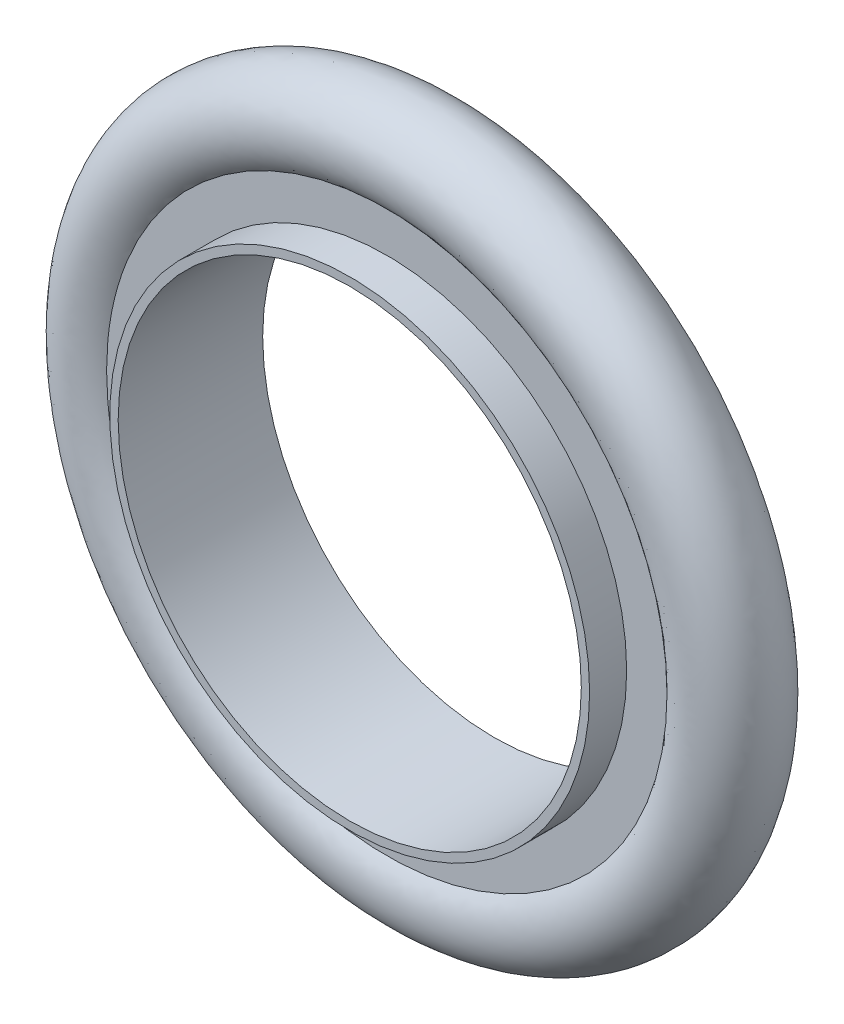
ISO-10303-21;
HEADER;
FILE_DESCRIPTION(('STEP AP214'),'2;1');
FILE_NAME('part.step','',(''),(''),'','','');
FILE_SCHEMA(('AUTOMOTIVE_DESIGN { 1 0 10303 214 1 1 1 1 }'));
ENDSEC;
DATA;
#1=APPLICATION_CONTEXT('core data for automotive mechanical design processes');
#2=APPLICATION_PROTOCOL_DEFINITION('international standard','automotive_design',2000,#1);
#3=PRODUCT_CONTEXT('',#1,'mechanical');
#4=PRODUCT('Part','Part','',(#3));
#5=PRODUCT_RELATED_PRODUCT_CATEGORY('part','',(#4));
#6=PRODUCT_DEFINITION_FORMATION('','',#4);
#7=PRODUCT_DEFINITION_CONTEXT('part definition',#1,'design');
#8=PRODUCT_DEFINITION('design','',#6,#7);
#9=PRODUCT_DEFINITION_SHAPE('','',#8);
#10=(LENGTH_UNIT() NAMED_UNIT(*) SI_UNIT(.MILLI.,.METRE.));
#11=(NAMED_UNIT(*) PLANE_ANGLE_UNIT() SI_UNIT($,.RADIAN.));
#12=(NAMED_UNIT(*) SI_UNIT($,.STERADIAN.) SOLID_ANGLE_UNIT());
#13=UNCERTAINTY_MEASURE_WITH_UNIT(LENGTH_MEASURE(1.E-05),#10,'distance_accuracy_value','');
#14=(GEOMETRIC_REPRESENTATION_CONTEXT(3) GLOBAL_UNCERTAINTY_ASSIGNED_CONTEXT((#13)) GLOBAL_UNIT_ASSIGNED_CONTEXT((#10,
#11,#12)) REPRESENTATION_CONTEXT('',''));
#15=CARTESIAN_POINT('',(0.,0.,0.));
#16=DIRECTION('',(0.,0.,1.));
#17=DIRECTION('',(1.,0.,0.));
#18=AXIS2_PLACEMENT_3D('',#15,#16,#17);
#19=CARTESIAN_POINT('',(0.,0.,-3.9));
#20=DIRECTION('',(0.,0.,1.));
#21=DIRECTION('',(1.,0.,0.));
#22=AXIS2_PLACEMENT_3D('',#19,#20,#21);
#23=CYLINDRICAL_SURFACE('',#22,12.95);
#24=CARTESIAN_POINT('',(0.,0.,-1.9));
#25=DIRECTION('',(0.,0.,1.));
#26=DIRECTION('',(1.,0.,0.));
#27=AXIS2_PLACEMENT_3D('',#24,#25,#26);
#28=CIRCLE('',#27,12.95);
#29=CARTESIAN_POINT('',(12.95,0.,-1.9));
#30=VERTEX_POINT('',#29);
#31=EDGE_CURVE('P0_E42',#30,#30,#28,.T.);
#32=ORIENTED_EDGE('',*,*,#31,.F.);
#33=EDGE_LOOP('',(#32));
#34=FACE_BOUND('',#33,.T.);
#35=CARTESIAN_POINT('',(0.,0.,-3.9));
#36=DIRECTION('',(0.,0.,-1.));
#37=DIRECTION('',(1.,0.,0.));
#38=AXIS2_PLACEMENT_3D('',#35,#36,#37);
#39=CIRCLE('',#38,12.95);
#40=CARTESIAN_POINT('',(12.95,0.,-3.9));
#41=VERTEX_POINT('',#40);
#42=EDGE_CURVE('P0_E10',#41,#41,#39,.T.);
#43=ORIENTED_EDGE('',*,*,#42,.F.);
#44=EDGE_LOOP('',(#43));
#45=FACE_BOUND('',#44,.T.);
#46=ADVANCED_FACE('P0_F16',(#34,#45),#23,.T.);
#47=CARTESIAN_POINT('',(-12.95,13.21159,-3.9));
#48=DIRECTION('',(0.,0.,-1.));
#49=DIRECTION('',(0.,-1.,0.));
#50=AXIS2_PLACEMENT_3D('',#47,#48,#49);
#51=PLANE('',#50);
#52=ORIENTED_EDGE('',*,*,#42,.T.);
#53=EDGE_LOOP('',(#52));
#54=FACE_BOUND('',#53,.T.);
#55=CARTESIAN_POINT('',(0.,0.,-3.9));
#56=DIRECTION('',(0.,0.,1.));
#57=DIRECTION('',(1.,0.,0.));
#58=AXIS2_PLACEMENT_3D('',#55,#56,#57);
#59=CIRCLE('',#58,12.5);
#60=CARTESIAN_POINT('',(12.5,0.,-3.9));
#61=VERTEX_POINT('',#60);
#62=EDGE_CURVE('P0_E29',#61,#61,#59,.T.);
#63=ORIENTED_EDGE('',*,*,#62,.T.);
#64=EDGE_LOOP('',(#63));
#65=FACE_BOUND('',#64,.T.);
#66=ADVANCED_FACE('P0_F120',(#54,#65),#51,.T.);
#67=CARTESIAN_POINT('',(-15.1251923190728,15.4307212039181,-1.9));
#68=DIRECTION('',(0.,0.,-1.));
#69=DIRECTION('',(0.,-1.,0.));
#70=AXIS2_PLACEMENT_3D('',#67,#68,#69);
#71=PLANE('',#70);
#72=CARTESIAN_POINT('',(0.,0.,-1.9));
#73=DIRECTION('',(0.,0.,-1.));
#74=DIRECTION('',(1.,0.,0.));
#75=AXIS2_PLACEMENT_3D('',#72,#73,#74);
#76=CIRCLE('',#75,15.1251923190728);
#77=CARTESIAN_POINT('',(15.1251923190728,0.,-1.9));
#78=VERTEX_POINT('',#77);
#79=EDGE_CURVE('P0_E69',#78,#78,#76,.T.);
#80=ORIENTED_EDGE('',*,*,#79,.T.);
#81=EDGE_LOOP('',(#80));
#82=FACE_BOUND('',#81,.T.);
#83=ORIENTED_EDGE('',*,*,#31,.T.);
#84=EDGE_LOOP('',(#83));
#85=FACE_BOUND('',#84,.T.);
#86=ADVANCED_FACE('P0_F126',(#82,#85),#71,.T.);
#87=CARTESIAN_POINT('',(0.,0.,3.9));
#88=DIRECTION('',(0.,0.,1.));
#89=DIRECTION('',(1.,0.,0.));
#90=AXIS2_PLACEMENT_3D('',#87,#88,#89);
#91=CYLINDRICAL_SURFACE('',#90,12.5);
#92=CARTESIAN_POINT('',(0.,0.,3.9));
#93=DIRECTION('',(0.,0.,-1.));
#94=DIRECTION('',(1.,0.,0.));
#95=AXIS2_PLACEMENT_3D('',#92,#93,#94);
#96=CIRCLE('',#95,12.5);
#97=CARTESIAN_POINT('',(12.5,0.,3.9));
#98=VERTEX_POINT('',#97);
#99=EDGE_CURVE('P0_E92',#98,#98,#96,.T.);
#100=ORIENTED_EDGE('',*,*,#99,.F.);
#101=EDGE_LOOP('',(#100));
#102=FACE_BOUND('',#101,.T.);
#103=ORIENTED_EDGE('',*,*,#62,.F.);
#104=EDGE_LOOP('',(#103));
#105=FACE_BOUND('',#104,.T.);
#106=ADVANCED_FACE('P0_F76',(#102,#105),#91,.F.);
#107=CARTESIAN_POINT('',(15.1251923190728,0.,-1.9));
#108=CARTESIAN_POINT('',(15.1251923190728,30.2503846381455,-1.9));
#109=CARTESIAN_POINT('',(-15.1251923190728,30.2503846381455,-1.9));
#110=CARTESIAN_POINT('',(-15.1251923190728,0.,-1.9));
#111=CARTESIAN_POINT('',(-15.1251923190728,-30.2503846381455,-1.9));
#112=CARTESIAN_POINT('',(15.1251923190728,-30.2503846381455,-1.9));
#113=CARTESIAN_POINT('',(15.1251923190728,0.,-1.9));
#114=CARTESIAN_POINT('',(13.8694561444583,0.,-0.826142220141142));
#115=CARTESIAN_POINT('',(13.8694561444583,27.7389122889165,-0.826142220141142));
#116=CARTESIAN_POINT('',(-13.8694561444583,27.7389122889165,-0.826142220141142));
#117=CARTESIAN_POINT('',(-13.8694561444583,0.,-0.826142220141142));
#118=CARTESIAN_POINT('',(-13.8694561444583,-27.7389122889165,-0.826142220141142));
#119=CARTESIAN_POINT('',(13.8694561444583,-27.7389122889165,-0.826142220141142));
#120=CARTESIAN_POINT('',(13.8694561444583,0.,-0.826142220141142));
#121=CARTESIAN_POINT('',(13.8694561444583,0.,0.826142220141143));
#122=CARTESIAN_POINT('',(13.8694561444583,27.7389122889165,0.826142220141142));
#123=CARTESIAN_POINT('',(-13.8694561444583,27.7389122889165,0.826142220141142));
#124=CARTESIAN_POINT('',(-13.8694561444583,0.,0.826142220141143));
#125=CARTESIAN_POINT('',(-13.8694561444583,-27.7389122889165,0.826142220141142));
#126=CARTESIAN_POINT('',(13.8694561444583,-27.7389122889165,0.826142220141142));
#127=CARTESIAN_POINT('',(13.8694561444583,0.,0.826142220141143));
#128=CARTESIAN_POINT('',(15.1251923190728,0.,1.9));
#129=CARTESIAN_POINT('',(15.1251923190728,30.2503846381455,1.9));
#130=CARTESIAN_POINT('',(-15.1251923190728,30.2503846381455,1.9));
#131=CARTESIAN_POINT('',(-15.1251923190728,0.,1.9));
#132=CARTESIAN_POINT('',(-15.1251923190728,-30.2503846381455,1.9));
#133=CARTESIAN_POINT('',(15.1251923190728,-30.2503846381455,1.9));
#134=CARTESIAN_POINT('',(15.1251923190728,0.,1.9));
#135=(BOUNDED_SURFACE() B_SPLINE_SURFACE(3,3,((#107,#108,#109,#110,#111,#112,#113),(#114,#115,
#116,#117,#118,#119,#120),(#121,#122,#123,#124,#125,#126,#127),(#128,#129,#130,#131,#132,#133,
#134)),.UNSPECIFIED.,.F.,.T.,.F.) B_SPLINE_SURFACE_WITH_KNOTS((4,4),(4,3,4),(0.,1.),(0.,0.5,1.),
.UNSPECIFIED.) GEOMETRIC_REPRESENTATION_ITEM() RATIONAL_B_SPLINE_SURFACE(((1.,0.333333333333334,
0.333333333333334,1.,0.333333333333334,0.333333333333334,1.),(0.766615381580585,
0.255538460526862,0.255538460526862,0.766615381580585,0.255538460526862,0.255538460526862,
0.766615381580585),(0.766615381580585,0.255538460526862,0.255538460526862,0.766615381580585,
0.255538460526862,0.255538460526862,0.766615381580585),(1.,0.333333333333334,0.333333333333334,
1.,0.333333333333334,0.333333333333334,1.))) REPRESENTATION_ITEM('') SURFACE());
#136=CARTESIAN_POINT('',(0.,0.,1.9));
#137=DIRECTION('',(0.,0.,1.));
#138=DIRECTION('',(1.,0.,0.));
#139=AXIS2_PLACEMENT_3D('',#136,#137,#138);
#140=CIRCLE('',#139,15.1251923190728);
#141=CARTESIAN_POINT('',(15.1251923190728,0.,1.9));
#142=VERTEX_POINT('',#141);
#143=EDGE_CURVE('P0_E22',#142,#142,#140,.T.);
#144=ORIENTED_EDGE('',*,*,#143,.F.);
#145=EDGE_LOOP('',(#144));
#146=FACE_BOUND('',#145,.T.);
#147=ORIENTED_EDGE('',*,*,#79,.F.);
#148=EDGE_LOOP('',(#147));
#149=FACE_BOUND('',#148,.T.);
#150=ADVANCED_FACE('P0_F18',(#146,#149),#135,.F.);
#151=CARTESIAN_POINT('',(-12.95,-13.21159,3.9));
#152=DIRECTION('',(0.,0.,1.));
#153=DIRECTION('',(1.,0.,0.));
#154=AXIS2_PLACEMENT_3D('',#151,#152,#153);
#155=PLANE('',#154);
#156=CARTESIAN_POINT('',(0.,0.,3.9));
#157=DIRECTION('',(0.,0.,1.));
#158=DIRECTION('',(1.,0.,0.));
#159=AXIS2_PLACEMENT_3D('',#156,#157,#158);
#160=CIRCLE('',#159,12.95);
#161=CARTESIAN_POINT('',(12.95,0.,3.9));
#162=VERTEX_POINT('',#161);
#163=EDGE_CURVE('P0_E91',#162,#162,#160,.T.);
#164=ORIENTED_EDGE('',*,*,#163,.T.);
#165=EDGE_LOOP('',(#164));
#166=FACE_BOUND('',#165,.T.);
#167=ORIENTED_EDGE('',*,*,#99,.T.);
#168=EDGE_LOOP('',(#167));
#169=FACE_BOUND('',#168,.T.);
#170=ADVANCED_FACE('P0_F101',(#166,#169),#155,.T.);
#171=CARTESIAN_POINT('',(-15.1251923190728,-15.4307212039181,1.9));
#172=DIRECTION('',(0.,0.,1.));
#173=DIRECTION('',(1.,0.,0.));
#174=AXIS2_PLACEMENT_3D('',#171,#172,#173);
#175=PLANE('',#174);
#176=ORIENTED_EDGE('',*,*,#143,.T.);
#177=EDGE_LOOP('',(#176));
#178=FACE_BOUND('',#177,.T.);
#179=CARTESIAN_POINT('',(0.,0.,1.9));
#180=DIRECTION('',(0.,0.,-1.));
#181=DIRECTION('',(1.,0.,0.));
#182=AXIS2_PLACEMENT_3D('',#179,#180,#181);
#183=CIRCLE('',#182,12.95);
#184=CARTESIAN_POINT('',(12.95,0.,1.9));
#185=VERTEX_POINT('',#184);
#186=EDGE_CURVE('P0_E85',#185,#185,#183,.T.);
#187=ORIENTED_EDGE('',*,*,#186,.T.);
#188=EDGE_LOOP('',(#187));
#189=FACE_BOUND('',#188,.T.);
#190=ADVANCED_FACE('P0_F107',(#178,#189),#175,.T.);
#191=CARTESIAN_POINT('',(0.,0.,1.9));
#192=DIRECTION('',(0.,0.,1.));
#193=DIRECTION('',(1.,0.,0.));
#194=AXIS2_PLACEMENT_3D('',#191,#192,#193);
#195=CYLINDRICAL_SURFACE('',#194,12.95);
#196=ORIENTED_EDGE('',*,*,#163,.F.);
#197=EDGE_LOOP('',(#196));
#198=FACE_BOUND('',#197,.T.);
#199=ORIENTED_EDGE('',*,*,#186,.F.);
#200=EDGE_LOOP('',(#199));
#201=FACE_BOUND('',#200,.T.);
#202=ADVANCED_FACE('P0_F104',(#198,#201),#195,.T.);
#203=CLOSED_SHELL('',(#46,#66,#86,#106,#150,#170,#190,#202));
#204=MANIFOLD_SOLID_BREP('P0_B1',#203);
#205=CARTESIAN_POINT('',(14.25,0.,0.));
#206=CARTESIAN_POINT('',(14.25,28.5,0.));
#207=CARTESIAN_POINT('',(-14.25,28.5,0.));
#208=CARTESIAN_POINT('',(-14.25,0.,0.));
#209=CARTESIAN_POINT('',(-14.25,-28.5,0.));
#210=CARTESIAN_POINT('',(14.25,-28.5,0.));
#211=CARTESIAN_POINT('',(14.25,0.,0.));
#212=CARTESIAN_POINT('',(14.25,0.,-4.99999999999999));
#213=CARTESIAN_POINT('',(14.25,28.5000000000001,-5.00000000000001));
#214=CARTESIAN_POINT('',(-14.25,28.5000000000001,-5.00000000000001));
#215=CARTESIAN_POINT('',(-14.25,0.,-4.99999999999999));
#216=CARTESIAN_POINT('',(-14.25,-28.5000000000001,-5.00000000000001));
#217=CARTESIAN_POINT('',(14.25,-28.5000000000001,-5.00000000000001));
#218=CARTESIAN_POINT('',(14.25,0.,-4.99999999999999));
#219=CARTESIAN_POINT('',(19.25,0.,-4.99999999999999));
#220=CARTESIAN_POINT('',(19.25,38.5,-5.00000000000001));
#221=CARTESIAN_POINT('',(-19.25,38.5,-5.00000000000001));
#222=CARTESIAN_POINT('',(-19.25,0.,-4.99999999999999));
#223=CARTESIAN_POINT('',(-19.25,-38.5,-5.00000000000001));
#224=CARTESIAN_POINT('',(19.25,-38.5,-5.00000000000001));
#225=CARTESIAN_POINT('',(19.25,0.,-4.99999999999999));
#226=CARTESIAN_POINT('',(19.25,0.,0.));
#227=CARTESIAN_POINT('',(19.25,38.4999999999999,0.));
#228=CARTESIAN_POINT('',(-19.25,38.4999999999999,0.));
#229=CARTESIAN_POINT('',(-19.25,0.,0.));
#230=CARTESIAN_POINT('',(-19.25,-38.4999999999999,0.));
#231=CARTESIAN_POINT('',(19.25,-38.4999999999999,0.));
#232=CARTESIAN_POINT('',(19.25,0.,0.));
#233=CARTESIAN_POINT('',(19.25,0.,4.99999999999999));
#234=CARTESIAN_POINT('',(19.25,38.5,5.00000000000001));
#235=CARTESIAN_POINT('',(-19.25,38.5,5.00000000000001));
#236=CARTESIAN_POINT('',(-19.25,0.,4.99999999999999));
#237=CARTESIAN_POINT('',(-19.25,-38.5,5.00000000000001));
#238=CARTESIAN_POINT('',(19.25,-38.5,5.00000000000001));
#239=CARTESIAN_POINT('',(19.25,0.,4.99999999999999));
#240=CARTESIAN_POINT('',(14.25,0.,4.99999999999999));
#241=CARTESIAN_POINT('',(14.25,28.5000000000001,5.00000000000001));
#242=CARTESIAN_POINT('',(-14.25,28.5000000000001,5.00000000000001));
#243=CARTESIAN_POINT('',(-14.25,0.,4.99999999999999));
#244=CARTESIAN_POINT('',(-14.25,-28.5000000000001,5.00000000000001));
#245=CARTESIAN_POINT('',(14.25,-28.5000000000001,5.00000000000001));
#246=CARTESIAN_POINT('',(14.25,0.,4.99999999999999));
#247=CARTESIAN_POINT('',(14.25,0.,0.));
#248=CARTESIAN_POINT('',(14.25,28.5,0.));
#249=CARTESIAN_POINT('',(-14.25,28.5,0.));
#250=CARTESIAN_POINT('',(-14.25,0.,0.));
#251=CARTESIAN_POINT('',(-14.25,-28.5,0.));
#252=CARTESIAN_POINT('',(14.25,-28.5,0.));
#253=CARTESIAN_POINT('',(14.25,0.,0.));
#254=(BOUNDED_SURFACE() B_SPLINE_SURFACE(3,3,((#205,#206,#207,#208,#209,#210,#211),(#212,#213,
#214,#215,#216,#217,#218),(#219,#220,#221,#222,#223,#224,#225),(#226,#227,#228,#229,#230,#231,
#232),(#233,#234,#235,#236,#237,#238,#239),(#240,#241,#242,#243,#244,#245,#246),(#247,#248,#249,
#250,#251,#252,#253)),.UNSPECIFIED.,.T.,.T.,.F.) B_SPLINE_SURFACE_WITH_KNOTS((4,3,4),(4,3,4),
(0.,0.5,1.),(0.,0.5,1.),
.UNSPECIFIED.) GEOMETRIC_REPRESENTATION_ITEM() RATIONAL_B_SPLINE_SURFACE(((1.,0.333333333333334,
0.333333333333334,1.,0.333333333333334,0.333333333333334,1.),(0.333333333333334,
0.111111111111111,0.111111111111111,0.333333333333334,0.111111111111111,0.111111111111111,
0.333333333333334),(0.333333333333334,0.111111111111111,0.111111111111111,0.333333333333334,
0.111111111111111,0.111111111111111,0.333333333333334),(1.,0.333333333333334,0.333333333333334,
1.,0.333333333333334,0.333333333333334,1.),(0.333333333333334,0.111111111111111,
0.111111111111111,0.333333333333334,0.111111111111111,0.111111111111111,0.333333333333334),
(0.333333333333334,0.111111111111111,0.111111111111111,0.333333333333334,0.111111111111111,
0.111111111111111,0.333333333333334),(1.,0.333333333333334,0.333333333333334,1.,
0.333333333333334,0.333333333333334,1.))) REPRESENTATION_ITEM('') SURFACE());
#255=ADVANCED_FACE('P1_F13',(),#254,.F.);
#256=CLOSED_SHELL('',(#255));
#257=MANIFOLD_SOLID_BREP('P1_B1',#256);
#258=ADVANCED_BREP_SHAPE_REPRESENTATION('',(#18,#204,#257),#14);
#259=SHAPE_DEFINITION_REPRESENTATION(#9,#258);
ENDSEC;
END-ISO-10303-21;
